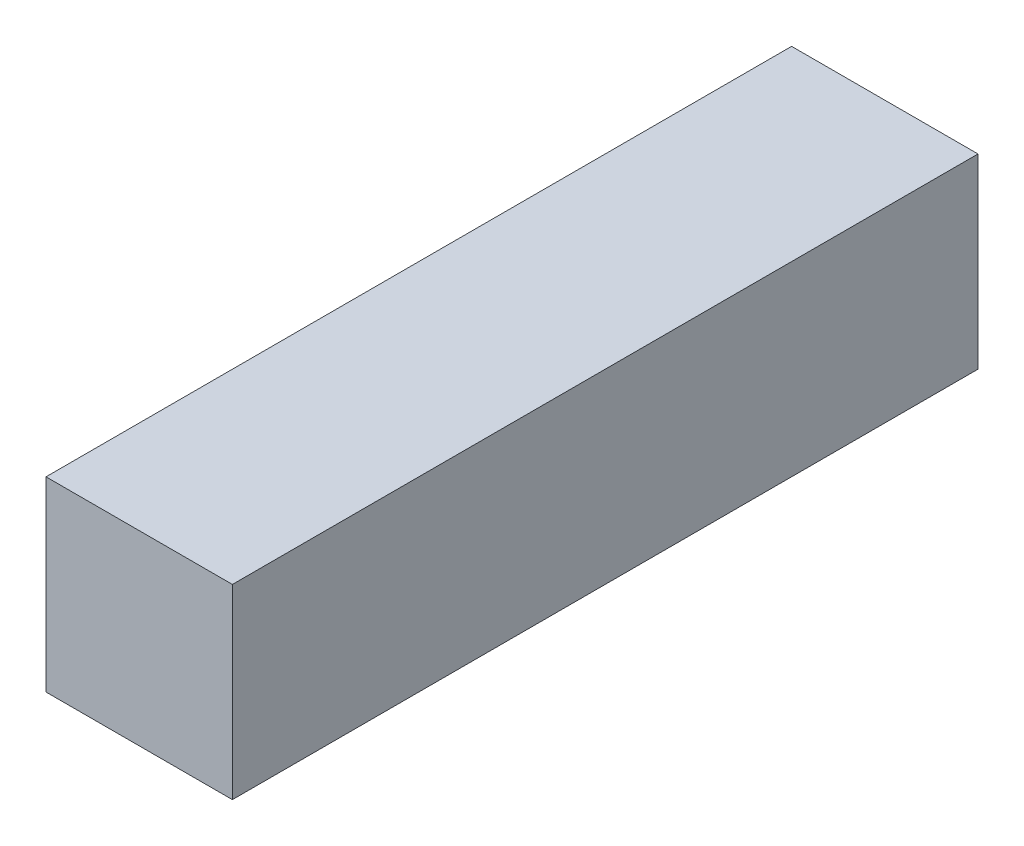
ISO-10303-21;
HEADER;
FILE_DESCRIPTION(('STEP AP214'),'2;1');
FILE_NAME('part.step','',(''),(''),'','','');
FILE_SCHEMA(('AUTOMOTIVE_DESIGN { 1 0 10303 214 1 1 1 1 }'));
ENDSEC;
DATA;
#1=APPLICATION_CONTEXT('core data for automotive mechanical design processes');
#2=APPLICATION_PROTOCOL_DEFINITION('international standard','automotive_design',2000,#1);
#3=PRODUCT_CONTEXT('',#1,'mechanical');
#4=PRODUCT('Part','Part','',(#3));
#5=PRODUCT_RELATED_PRODUCT_CATEGORY('part','',(#4));
#6=PRODUCT_DEFINITION_FORMATION('','',#4);
#7=PRODUCT_DEFINITION_CONTEXT('part definition',#1,'design');
#8=PRODUCT_DEFINITION('design','',#6,#7);
#9=PRODUCT_DEFINITION_SHAPE('','',#8);
#10=(LENGTH_UNIT() NAMED_UNIT(*) SI_UNIT(.MILLI.,.METRE.));
#11=(NAMED_UNIT(*) PLANE_ANGLE_UNIT() SI_UNIT($,.RADIAN.));
#12=(NAMED_UNIT(*) SI_UNIT($,.STERADIAN.) SOLID_ANGLE_UNIT());
#13=UNCERTAINTY_MEASURE_WITH_UNIT(LENGTH_MEASURE(1.E-05),#10,'distance_accuracy_value','');
#14=(GEOMETRIC_REPRESENTATION_CONTEXT(3) GLOBAL_UNCERTAINTY_ASSIGNED_CONTEXT((#13)) GLOBAL_UNIT_ASSIGNED_CONTEXT((#10,
#11,#12)) REPRESENTATION_CONTEXT('',''));
#15=CARTESIAN_POINT('',(0.,0.,0.));
#16=DIRECTION('',(0.,0.,1.));
#17=DIRECTION('',(1.,0.,0.));
#18=AXIS2_PLACEMENT_3D('',#15,#16,#17);
#19=CARTESIAN_POINT('',(1.5,-1.5,12.));
#20=DIRECTION('',(-1.,0.,0.));
#21=DIRECTION('',(0.,0.,1.));
#22=AXIS2_PLACEMENT_3D('',#19,#20,#21);
#23=PLANE('',#22);
#24=DIRECTION('',(0.,1.,0.));
#25=VECTOR('',#24,1.);
#26=CARTESIAN_POINT('',(1.5,-1.5,0.));
#27=LINE('',#26,#25);
#28=CARTESIAN_POINT('',(1.5,-1.5,0.));
#29=VERTEX_POINT('',#28);
#30=CARTESIAN_POINT('',(1.5,1.5,0.));
#31=VERTEX_POINT('',#30);
#32=EDGE_CURVE('E102',#29,#31,#27,.T.);
#33=ORIENTED_EDGE('',*,*,#32,.T.);
#34=DIRECTION('',(0.,0.,-1.));
#35=VECTOR('',#34,1.);
#36=CARTESIAN_POINT('',(1.5,1.5,12.));
#37=LINE('',#36,#35);
#38=CARTESIAN_POINT('',(1.5,1.5,12.));
#39=VERTEX_POINT('',#38);
#40=EDGE_CURVE('E11',#39,#31,#37,.T.);
#41=ORIENTED_EDGE('',*,*,#40,.F.);
#42=DIRECTION('',(0.,1.,0.));
#43=VECTOR('',#42,1.);
#44=CARTESIAN_POINT('',(1.5,-1.5,12.));
#45=LINE('',#44,#43);
#46=CARTESIAN_POINT('',(1.5,-1.5,12.));
#47=VERTEX_POINT('',#46);
#48=EDGE_CURVE('E90',#47,#39,#45,.T.);
#49=ORIENTED_EDGE('',*,*,#48,.F.);
#50=DIRECTION('',(0.,0.,-1.));
#51=VECTOR('',#50,1.);
#52=CARTESIAN_POINT('',(1.5,-1.5,12.));
#53=LINE('',#52,#51);
#54=EDGE_CURVE('E98',#47,#29,#53,.T.);
#55=ORIENTED_EDGE('',*,*,#54,.T.);
#56=EDGE_LOOP('',(#33,#41,#49,#55));
#57=FACE_BOUND('',#56,.T.);
#58=ADVANCED_FACE('F39',(#57),#23,.F.);
#59=CARTESIAN_POINT('',(-1.5,1.5,12.));
#60=DIRECTION('',(0.,-1.,0.));
#61=DIRECTION('',(0.,0.,-1.));
#62=AXIS2_PLACEMENT_3D('',#59,#60,#61);
#63=PLANE('',#62);
#64=DIRECTION('',(-1.,0.,0.));
#65=VECTOR('',#64,1.);
#66=CARTESIAN_POINT('',(-1.5,1.5,0.));
#67=LINE('',#66,#65);
#68=CARTESIAN_POINT('',(-1.5,1.5,0.));
#69=VERTEX_POINT('',#68);
#70=EDGE_CURVE('E94',#31,#69,#67,.T.);
#71=ORIENTED_EDGE('',*,*,#70,.T.);
#72=DIRECTION('',(0.,0.,-1.));
#73=VECTOR('',#72,1.);
#74=CARTESIAN_POINT('',(-1.5,1.5,12.));
#75=LINE('',#74,#73);
#76=CARTESIAN_POINT('',(-1.5,1.5,12.));
#77=VERTEX_POINT('',#76);
#78=EDGE_CURVE('E47',#77,#69,#75,.T.);
#79=ORIENTED_EDGE('',*,*,#78,.F.);
#80=DIRECTION('',(-1.,0.,0.));
#81=VECTOR('',#80,1.);
#82=CARTESIAN_POINT('',(-1.5,1.5,12.));
#83=LINE('',#82,#81);
#84=EDGE_CURVE('E85',#39,#77,#83,.T.);
#85=ORIENTED_EDGE('',*,*,#84,.F.);
#86=ORIENTED_EDGE('',*,*,#40,.T.);
#87=EDGE_LOOP('',(#71,#79,#85,#86));
#88=FACE_BOUND('',#87,.T.);
#89=ADVANCED_FACE('F93',(#88),#63,.F.);
#90=CARTESIAN_POINT('',(-1.5,-1.5,12.));
#91=DIRECTION('',(1.,0.,0.));
#92=DIRECTION('',(0.,0.,-1.));
#93=AXIS2_PLACEMENT_3D('',#90,#91,#92);
#94=PLANE('',#93);
#95=DIRECTION('',(0.,-1.,0.));
#96=VECTOR('',#95,1.);
#97=CARTESIAN_POINT('',(-1.5,-1.5,0.));
#98=LINE('',#97,#96);
#99=CARTESIAN_POINT('',(-1.5,-1.5,0.));
#100=VERTEX_POINT('',#99);
#101=EDGE_CURVE('E72',#69,#100,#98,.T.);
#102=ORIENTED_EDGE('',*,*,#101,.T.);
#103=DIRECTION('',(0.,0.,-1.));
#104=VECTOR('',#103,1.);
#105=CARTESIAN_POINT('',(-1.5,-1.5,12.));
#106=LINE('',#105,#104);
#107=CARTESIAN_POINT('',(-1.5,-1.5,12.));
#108=VERTEX_POINT('',#107);
#109=EDGE_CURVE('E95',#108,#100,#106,.T.);
#110=ORIENTED_EDGE('',*,*,#109,.F.);
#111=DIRECTION('',(0.,-1.,0.));
#112=VECTOR('',#111,1.);
#113=CARTESIAN_POINT('',(-1.5,-1.5,12.));
#114=LINE('',#113,#112);
#115=EDGE_CURVE('E88',#77,#108,#114,.T.);
#116=ORIENTED_EDGE('',*,*,#115,.F.);
#117=ORIENTED_EDGE('',*,*,#78,.T.);
#118=EDGE_LOOP('',(#102,#110,#116,#117));
#119=FACE_BOUND('',#118,.T.);
#120=ADVANCED_FACE('F96',(#119),#94,.F.);
#121=CARTESIAN_POINT('',(-1.5,-1.5,12.));
#122=DIRECTION('',(0.,1.,0.));
#123=DIRECTION('',(0.,0.,1.));
#124=AXIS2_PLACEMENT_3D('',#121,#122,#123);
#125=PLANE('',#124);
#126=DIRECTION('',(1.,0.,0.));
#127=VECTOR('',#126,1.);
#128=CARTESIAN_POINT('',(-1.5,-1.5,0.));
#129=LINE('',#128,#127);
#130=EDGE_CURVE('E78',#100,#29,#129,.T.);
#131=ORIENTED_EDGE('',*,*,#130,.T.);
#132=ORIENTED_EDGE('',*,*,#54,.F.);
#133=DIRECTION('',(1.,0.,0.));
#134=VECTOR('',#133,1.);
#135=CARTESIAN_POINT('',(-1.5,-1.5,12.));
#136=LINE('',#135,#134);
#137=EDGE_CURVE('E55',#108,#47,#136,.T.);
#138=ORIENTED_EDGE('',*,*,#137,.F.);
#139=ORIENTED_EDGE('',*,*,#109,.T.);
#140=EDGE_LOOP('',(#131,#132,#138,#139));
#141=FACE_BOUND('',#140,.T.);
#142=ADVANCED_FACE('F109',(#141),#125,.F.);
#143=CARTESIAN_POINT('',(0.,0.,12.));
#144=DIRECTION('',(0.,0.,-1.));
#145=DIRECTION('',(-1.,0.,0.));
#146=AXIS2_PLACEMENT_3D('',#143,#144,#145);
#147=PLANE('',#146);
#148=ORIENTED_EDGE('',*,*,#48,.T.);
#149=ORIENTED_EDGE('',*,*,#84,.T.);
#150=ORIENTED_EDGE('',*,*,#115,.T.);
#151=ORIENTED_EDGE('',*,*,#137,.T.);
#152=EDGE_LOOP('',(#148,#149,#150,#151));
#153=FACE_BOUND('',#152,.T.);
#154=ADVANCED_FACE('F86',(#153),#147,.F.);
#155=CARTESIAN_POINT('',(0.,0.,0.));
#156=DIRECTION('',(0.,0.,-1.));
#157=DIRECTION('',(-1.,0.,0.));
#158=AXIS2_PLACEMENT_3D('',#155,#156,#157);
#159=PLANE('',#158);
#160=ORIENTED_EDGE('',*,*,#32,.F.);
#161=ORIENTED_EDGE('',*,*,#130,.F.);
#162=ORIENTED_EDGE('',*,*,#101,.F.);
#163=ORIENTED_EDGE('',*,*,#70,.F.);
#164=EDGE_LOOP('',(#160,#161,#162,#163));
#165=FACE_BOUND('',#164,.T.);
#166=ADVANCED_FACE('F112',(#165),#159,.T.);
#167=CLOSED_SHELL('',(#58,#89,#120,#142,#154,#166));
#168=MANIFOLD_SOLID_BREP('B2',#167);
#169=ADVANCED_BREP_SHAPE_REPRESENTATION('',(#18,#168),#14);
#170=SHAPE_DEFINITION_REPRESENTATION(#9,#169);
ENDSEC;
END-ISO-10303-21;
